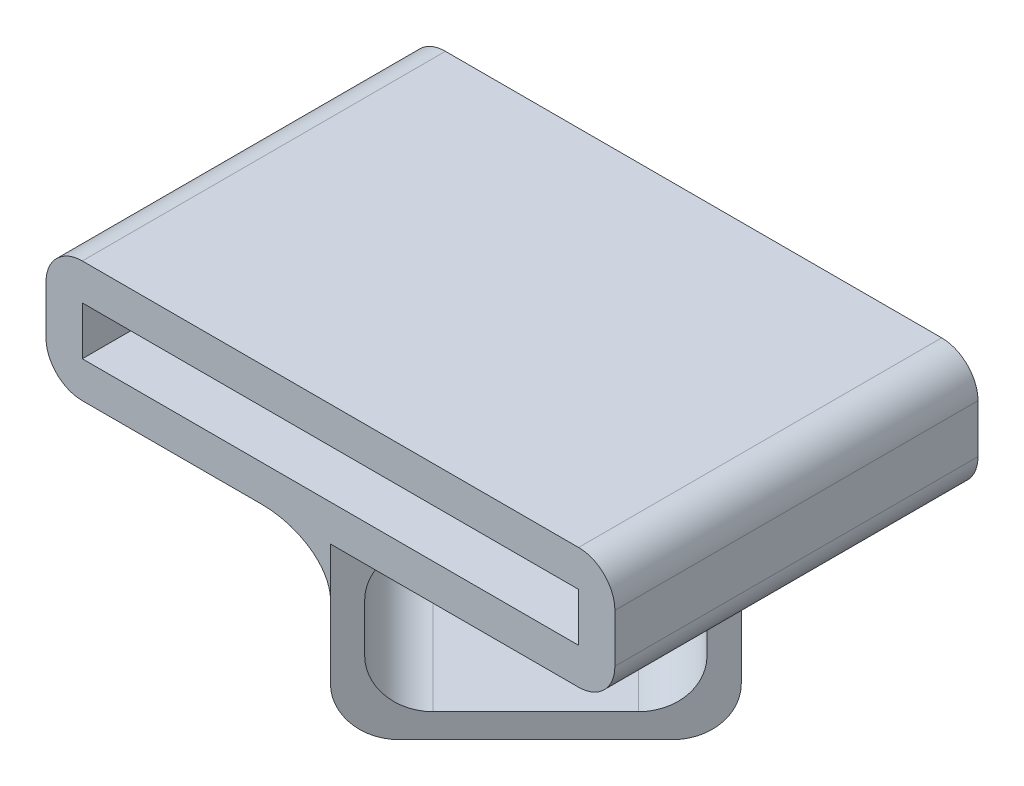
ISO-10303-21;
HEADER;
FILE_DESCRIPTION(('STEP AP214'),'2;1');
FILE_NAME('part.step','',(''),(''),'','','');
FILE_SCHEMA(('AUTOMOTIVE_DESIGN { 1 0 10303 214 1 1 1 1 }'));
ENDSEC;
DATA;
#1=APPLICATION_CONTEXT('core data for automotive mechanical design processes');
#2=APPLICATION_PROTOCOL_DEFINITION('international standard','automotive_design',2000,#1);
#3=PRODUCT_CONTEXT('',#1,'mechanical');
#4=PRODUCT('Part','Part','',(#3));
#5=PRODUCT_RELATED_PRODUCT_CATEGORY('part','',(#4));
#6=PRODUCT_DEFINITION_FORMATION('','',#4);
#7=PRODUCT_DEFINITION_CONTEXT('part definition',#1,'design');
#8=PRODUCT_DEFINITION('design','',#6,#7);
#9=PRODUCT_DEFINITION_SHAPE('','',#8);
#10=(LENGTH_UNIT() NAMED_UNIT(*) SI_UNIT(.MILLI.,.METRE.));
#11=(NAMED_UNIT(*) PLANE_ANGLE_UNIT() SI_UNIT($,.RADIAN.));
#12=(NAMED_UNIT(*) SI_UNIT($,.STERADIAN.) SOLID_ANGLE_UNIT());
#13=UNCERTAINTY_MEASURE_WITH_UNIT(LENGTH_MEASURE(1.E-05),#10,'distance_accuracy_value','');
#14=(GEOMETRIC_REPRESENTATION_CONTEXT(3) GLOBAL_UNCERTAINTY_ASSIGNED_CONTEXT((#13)) GLOBAL_UNIT_ASSIGNED_CONTEXT((#10,
#11,#12)) REPRESENTATION_CONTEXT('',''));
#15=CARTESIAN_POINT('',(0.,0.,0.));
#16=DIRECTION('',(0.,0.,1.));
#17=DIRECTION('',(1.,0.,0.));
#18=AXIS2_PLACEMENT_3D('',#15,#16,#17);
#19=CARTESIAN_POINT('',(1.5,-1.5,15.));
#20=DIRECTION('',(0.,1.,0.));
#21=DIRECTION('',(0.,0.,1.));
#22=AXIS2_PLACEMENT_3D('',#19,#20,#21);
#23=PLANE('',#22);
#24=DIRECTION('',(1.,0.,0.));
#25=VECTOR('',#24,1.);
#26=CARTESIAN_POINT('',(1.5,-1.5,0.));
#27=LINE('',#26,#25);
#28=CARTESIAN_POINT('',(-5.45101012677669,-1.5,0.));
#29=VERTEX_POINT('',#28);
#30=CARTESIAN_POINT('',(0.,-1.5,0.));
#31=VERTEX_POINT('',#30);
#32=EDGE_CURVE('E237',#29,#31,#27,.T.);
#33=ORIENTED_EDGE('',*,*,#32,.T.);
#34=DIRECTION('',(0.,0.,-1.));
#35=VECTOR('',#34,1.);
#36=CARTESIAN_POINT('',(0.,-1.5,15.));
#37=LINE('',#36,#35);
#38=CARTESIAN_POINT('',(0.,-1.5,15.));
#39=VERTEX_POINT('',#38);
#40=EDGE_CURVE('E433',#31,#39,#37,.F.);
#41=ORIENTED_EDGE('',*,*,#40,.T.);
#42=DIRECTION('',(1.,0.,0.));
#43=VECTOR('',#42,1.);
#44=CARTESIAN_POINT('',(1.5,-1.5,15.));
#45=LINE('',#44,#43);
#46=CARTESIAN_POINT('',(-10.25,-1.5,15.));
#47=VERTEX_POINT('',#46);
#48=EDGE_CURVE('E317',#47,#39,#45,.T.);
#49=ORIENTED_EDGE('',*,*,#48,.F.);
#50=DIRECTION('',(-0.707106781186547,0.,0.707106781186548));
#51=VECTOR('',#50,1.);
#52=CARTESIAN_POINT('',(-10.25,-1.5,15.));
#53=LINE('',#52,#51);
#54=CARTESIAN_POINT('',(-8.12867965644037,-1.5,12.8786796564404));
#55=VERTEX_POINT('',#54);
#56=EDGE_CURVE('E262',#55,#47,#53,.T.);
#57=ORIENTED_EDGE('',*,*,#56,.F.);
#58=DIRECTION('',(-0.707106781186548,0.,-0.707106781186547));
#59=VECTOR('',#58,1.);
#60=CARTESIAN_POINT('',(-14.6433982822018,-1.5,6.36396103067894));
#61=LINE('',#60,#59);
#62=CARTESIAN_POINT('',(-14.6433982822018,-1.5,6.36396103067894));
#63=VERTEX_POINT('',#62);
#64=EDGE_CURVE('E358',#55,#63,#61,.T.);
#65=ORIENTED_EDGE('',*,*,#64,.T.);
#66=DIRECTION('',(0.707106781186547,0.,-0.707106781186548));
#67=VECTOR('',#66,1.);
#68=CARTESIAN_POINT('',(-8.27943725152288,-1.5,0.));
#69=LINE('',#68,#67);
#70=CARTESIAN_POINT('',(-18.1789321881345,-1.5,9.89949493661168));
#71=VERTEX_POINT('',#70);
#72=EDGE_CURVE('E259',#71,#63,#69,.T.);
#73=ORIENTED_EDGE('',*,*,#72,.F.);
#74=DIRECTION('',(-0.707106781186549,0.,-0.707106781186546));
#75=VECTOR('',#74,1.);
#76=CARTESIAN_POINT('',(-11.6642135623731,-1.5,16.4142135623731));
#77=LINE('',#76,#75);
#78=CARTESIAN_POINT('',(-13.0784271247462,-1.5,15.));
#79=VERTEX_POINT('',#78);
#80=EDGE_CURVE('E355',#71,#79,#77,.F.);
#81=ORIENTED_EDGE('',*,*,#80,.T.);
#82=CARTESIAN_POINT('',(-20.5,-1.5,15.));
#83=VERTEX_POINT('',#82);
#84=EDGE_CURVE('E314',#83,#79,#45,.T.);
#85=ORIENTED_EDGE('',*,*,#84,.F.);
#86=DIRECTION('',(0.,0.,-1.));
#87=VECTOR('',#86,1.);
#88=CARTESIAN_POINT('',(-20.5,-1.5,15.));
#89=LINE('',#88,#87);
#90=CARTESIAN_POINT('',(-20.5,-1.5,0.));
#91=VERTEX_POINT('',#90);
#92=EDGE_CURVE('E234',#83,#91,#89,.T.);
#93=ORIENTED_EDGE('',*,*,#92,.T.);
#94=CARTESIAN_POINT('',(-8.27943725152288,-1.5,0.));
#95=VERTEX_POINT('',#94);
#96=EDGE_CURVE('E225',#91,#95,#27,.T.);
#97=ORIENTED_EDGE('',*,*,#96,.T.);
#98=CARTESIAN_POINT('',(-10.4007575950825,-1.5,2.12132034355964));
#99=VERTEX_POINT('',#98);
#100=EDGE_CURVE('E230',#99,#95,#69,.T.);
#101=ORIENTED_EDGE('',*,*,#100,.F.);
#102=DIRECTION('',(-0.707106781186548,0.,-0.707106781186547));
#103=VECTOR('',#102,1.);
#104=CARTESIAN_POINT('',(-3.88603896932108,-1.5,8.63603896932107));
#105=LINE('',#104,#103);
#106=CARTESIAN_POINT('',(-3.88603896932108,-1.5,8.63603896932107));
#107=VERTEX_POINT('',#106);
#108=EDGE_CURVE('E361',#99,#107,#105,.F.);
#109=ORIENTED_EDGE('',*,*,#108,.T.);
#110=CARTESIAN_POINT('',(-0.350505063388349,-1.5,5.10050506338832));
#111=VERTEX_POINT('',#110);
#112=EDGE_CURVE('E270',#111,#107,#53,.T.);
#113=ORIENTED_EDGE('',*,*,#112,.F.);
#114=DIRECTION('',(0.707106781186548,0.,0.707106781186547));
#115=VECTOR('',#114,1.);
#116=CARTESIAN_POINT('',(-6.86522368914979,-1.5,-1.4142135623731));
#117=LINE('',#116,#115);
#118=EDGE_CURVE('E363',#111,#29,#117,.F.);
#119=ORIENTED_EDGE('',*,*,#118,.T.);
#120=EDGE_LOOP('',(#33,#41,#49,#57,#65,#73,#81,#85,#93,#97,#101,#109,#113,#119));
#121=FACE_BOUND('',#120,.T.);
#122=ADVANCED_FACE('F33',(#121),#23,.F.);
#123=CARTESIAN_POINT('',(0.,0.,15.));
#124=DIRECTION('',(0.,0.,-1.));
#125=DIRECTION('',(-1.,0.,0.));
#126=AXIS2_PLACEMENT_3D('',#123,#124,#125);
#127=PLANE('',#126);
#128=DIRECTION('',(0.,1.,0.));
#129=VECTOR('',#128,1.);
#130=CARTESIAN_POINT('',(1.5,-1.5,15.));
#131=LINE('',#130,#129);
#132=CARTESIAN_POINT('',(1.5,0.,15.));
#133=VERTEX_POINT('',#132);
#134=CARTESIAN_POINT('',(1.5,2.,15.));
#135=VERTEX_POINT('',#134);
#136=EDGE_CURVE('E316',#133,#135,#131,.T.);
#137=ORIENTED_EDGE('',*,*,#136,.T.);
#138=CARTESIAN_POINT('',(0.,2.,15.));
#139=DIRECTION('',(0.,0.,-1.));
#140=DIRECTION('',(-1.,0.,0.));
#141=AXIS2_PLACEMENT_3D('',#138,#139,#140);
#142=CIRCLE('',#141,1.5);
#143=CARTESIAN_POINT('',(0.,3.5,15.));
#144=VERTEX_POINT('',#143);
#145=EDGE_CURVE('E430',#135,#144,#142,.F.);
#146=ORIENTED_EDGE('',*,*,#145,.T.);
#147=DIRECTION('',(-1.,0.,0.));
#148=VECTOR('',#147,1.);
#149=CARTESIAN_POINT('',(1.5,3.5,15.));
#150=LINE('',#149,#148);
#151=CARTESIAN_POINT('',(-20.5,3.5,15.));
#152=VERTEX_POINT('',#151);
#153=EDGE_CURVE('E320',#144,#152,#150,.T.);
#154=ORIENTED_EDGE('',*,*,#153,.T.);
#155=CARTESIAN_POINT('',(-20.5,2.,15.));
#156=DIRECTION('',(0.,0.,-1.));
#157=DIRECTION('',(-1.,0.,0.));
#158=AXIS2_PLACEMENT_3D('',#155,#156,#157);
#159=CIRCLE('',#158,1.5);
#160=CARTESIAN_POINT('',(-22.,2.,15.));
#161=VERTEX_POINT('',#160);
#162=EDGE_CURVE('E54',#152,#161,#159,.F.);
#163=ORIENTED_EDGE('',*,*,#162,.T.);
#164=DIRECTION('',(0.,-1.,0.));
#165=VECTOR('',#164,1.);
#166=CARTESIAN_POINT('',(-22.,-1.5,15.));
#167=LINE('',#166,#165);
#168=CARTESIAN_POINT('',(-22.,0.,15.));
#169=VERTEX_POINT('',#168);
#170=EDGE_CURVE('E322',#161,#169,#167,.T.);
#171=ORIENTED_EDGE('',*,*,#170,.T.);
#172=CARTESIAN_POINT('',(-20.5,0.,15.));
#173=DIRECTION('',(0.,0.,-1.));
#174=DIRECTION('',(-1.,0.,0.));
#175=AXIS2_PLACEMENT_3D('',#172,#173,#174);
#176=CIRCLE('',#175,1.5);
#177=EDGE_CURVE('E425',#169,#83,#176,.F.);
#178=ORIENTED_EDGE('',*,*,#177,.T.);
#179=ORIENTED_EDGE('',*,*,#84,.T.);
#180=CARTESIAN_POINT('',(-13.0784271247462,-3.5,15.));
#181=DIRECTION('',(0.,0.,-1.));
#182=DIRECTION('',(1.,0.,0.));
#183=AXIS2_PLACEMENT_3D('',#180,#181,#182);
#184=ELLIPSE('',#183,2.8284271247462,2.);
#185=CARTESIAN_POINT('',(-10.25,-3.5,15.));
#186=VERTEX_POINT('',#185);
#187=EDGE_CURVE('E252',#79,#186,#184,.T.);
#188=ORIENTED_EDGE('',*,*,#187,.T.);
#189=DIRECTION('',(0.,-1.,0.));
#190=VECTOR('',#189,1.);
#191=CARTESIAN_POINT('',(-10.25,-8.5,15.));
#192=LINE('',#191,#190);
#193=EDGE_CURVE('E251',#47,#186,#192,.T.);
#194=ORIENTED_EDGE('',*,*,#193,.F.);
#195=ORIENTED_EDGE('',*,*,#48,.T.);
#196=CARTESIAN_POINT('',(0.,0.,15.));
#197=DIRECTION('',(0.,0.,-1.));
#198=DIRECTION('',(-1.,0.,0.));
#199=AXIS2_PLACEMENT_3D('',#196,#197,#198);
#200=CIRCLE('',#199,1.5);
#201=EDGE_CURVE('E428',#39,#133,#200,.F.);
#202=ORIENTED_EDGE('',*,*,#201,.T.);
#203=EDGE_LOOP('',(#137,#146,#154,#163,#171,#178,#179,#188,#194,#195,#202));
#204=FACE_BOUND('',#203,.T.);
#205=DIRECTION('',(0.,1.,0.));
#206=VECTOR('',#205,1.);
#207=CARTESIAN_POINT('',(0.,0.,15.));
#208=LINE('',#207,#206);
#209=CARTESIAN_POINT('',(0.,0.,15.));
#210=VERTEX_POINT('',#209);
#211=CARTESIAN_POINT('',(0.,2.,15.));
#212=VERTEX_POINT('',#211);
#213=EDGE_CURVE('E284',#210,#212,#208,.T.);
#214=ORIENTED_EDGE('',*,*,#213,.F.);
#215=DIRECTION('',(1.,0.,0.));
#216=VECTOR('',#215,1.);
#217=CARTESIAN_POINT('',(0.,0.,15.));
#218=LINE('',#217,#216);
#219=CARTESIAN_POINT('',(-20.5,0.,15.));
#220=VERTEX_POINT('',#219);
#221=EDGE_CURVE('E292',#220,#210,#218,.T.);
#222=ORIENTED_EDGE('',*,*,#221,.F.);
#223=DIRECTION('',(0.,-1.,0.));
#224=VECTOR('',#223,1.);
#225=CARTESIAN_POINT('',(-20.5,0.,15.));
#226=LINE('',#225,#224);
#227=CARTESIAN_POINT('',(-20.5,2.,15.));
#228=VERTEX_POINT('',#227);
#229=EDGE_CURVE('E289',#228,#220,#226,.T.);
#230=ORIENTED_EDGE('',*,*,#229,.F.);
#231=DIRECTION('',(-1.,0.,0.));
#232=VECTOR('',#231,1.);
#233=CARTESIAN_POINT('',(0.,2.,15.));
#234=LINE('',#233,#232);
#235=EDGE_CURVE('E286',#212,#228,#234,.T.);
#236=ORIENTED_EDGE('',*,*,#235,.F.);
#237=EDGE_LOOP('',(#214,#222,#230,#236));
#238=FACE_BOUND('',#237,.T.);
#239=ADVANCED_FACE('F439',(#204,#238),#127,.F.);
#240=CARTESIAN_POINT('',(0.,0.,0.));
#241=DIRECTION('',(0.,0.,-1.));
#242=DIRECTION('',(-1.,0.,0.));
#243=AXIS2_PLACEMENT_3D('',#240,#241,#242);
#244=PLANE('',#243);
#245=DIRECTION('',(-1.,0.,0.));
#246=VECTOR('',#245,1.);
#247=CARTESIAN_POINT('',(1.5,3.5,0.));
#248=LINE('',#247,#246);
#249=CARTESIAN_POINT('',(0.,3.5,0.));
#250=VERTEX_POINT('',#249);
#251=CARTESIAN_POINT('',(-20.5,3.5,0.));
#252=VERTEX_POINT('',#251);
#253=EDGE_CURVE('E327',#250,#252,#248,.T.);
#254=ORIENTED_EDGE('',*,*,#253,.F.);
#255=CARTESIAN_POINT('',(0.,2.,0.));
#256=DIRECTION('',(0.,0.,-1.));
#257=DIRECTION('',(-1.,0.,0.));
#258=AXIS2_PLACEMENT_3D('',#255,#256,#257);
#259=CIRCLE('',#258,1.5);
#260=CARTESIAN_POINT('',(1.5,2.,0.));
#261=VERTEX_POINT('',#260);
#262=EDGE_CURVE('E418',#250,#261,#259,.T.);
#263=ORIENTED_EDGE('',*,*,#262,.T.);
#264=DIRECTION('',(0.,1.,0.));
#265=VECTOR('',#264,1.);
#266=CARTESIAN_POINT('',(1.5,-1.5,0.));
#267=LINE('',#266,#265);
#268=CARTESIAN_POINT('',(1.5,0.,0.));
#269=VERTEX_POINT('',#268);
#270=EDGE_CURVE('E236',#269,#261,#267,.T.);
#271=ORIENTED_EDGE('',*,*,#270,.F.);
#272=CARTESIAN_POINT('',(0.,0.,0.));
#273=DIRECTION('',(0.,0.,-1.));
#274=DIRECTION('',(-1.,0.,0.));
#275=AXIS2_PLACEMENT_3D('',#272,#273,#274);
#276=CIRCLE('',#275,1.5);
#277=EDGE_CURVE('E416',#269,#31,#276,.T.);
#278=ORIENTED_EDGE('',*,*,#277,.T.);
#279=ORIENTED_EDGE('',*,*,#32,.F.);
#280=CARTESIAN_POINT('',(-5.45101012677668,-3.5,0.));
#281=DIRECTION('',(0.,0.,-1.));
#282=DIRECTION('',(-1.,0.,0.));
#283=AXIS2_PLACEMENT_3D('',#280,#281,#282);
#284=ELLIPSE('',#283,2.82842712474619,2.);
#285=CARTESIAN_POINT('',(-8.27943725152288,-3.5,0.));
#286=VERTEX_POINT('',#285);
#287=EDGE_CURVE('E247',#29,#286,#284,.F.);
#288=ORIENTED_EDGE('',*,*,#287,.T.);
#289=DIRECTION('',(0.,-1.,0.));
#290=VECTOR('',#289,1.);
#291=CARTESIAN_POINT('',(-8.27943725152288,0.,0.));
#292=LINE('',#291,#290);
#293=EDGE_CURVE('E241',#95,#286,#292,.T.);
#294=ORIENTED_EDGE('',*,*,#293,.F.);
#295=ORIENTED_EDGE('',*,*,#96,.F.);
#296=CARTESIAN_POINT('',(-20.5,0.,0.));
#297=DIRECTION('',(0.,0.,-1.));
#298=DIRECTION('',(-1.,0.,0.));
#299=AXIS2_PLACEMENT_3D('',#296,#297,#298);
#300=CIRCLE('',#299,1.5);
#301=CARTESIAN_POINT('',(-22.,0.,0.));
#302=VERTEX_POINT('',#301);
#303=EDGE_CURVE('E412',#91,#302,#300,.T.);
#304=ORIENTED_EDGE('',*,*,#303,.T.);
#305=DIRECTION('',(0.,-1.,0.));
#306=VECTOR('',#305,1.);
#307=CARTESIAN_POINT('',(-22.,-1.5,0.));
#308=LINE('',#307,#306);
#309=CARTESIAN_POINT('',(-22.,2.,0.));
#310=VERTEX_POINT('',#309);
#311=EDGE_CURVE('E330',#310,#302,#308,.T.);
#312=ORIENTED_EDGE('',*,*,#311,.F.);
#313=CARTESIAN_POINT('',(-20.5,2.,0.));
#314=DIRECTION('',(0.,0.,-1.));
#315=DIRECTION('',(-1.,0.,0.));
#316=AXIS2_PLACEMENT_3D('',#313,#314,#315);
#317=CIRCLE('',#316,1.5);
#318=EDGE_CURVE('E414',#310,#252,#317,.T.);
#319=ORIENTED_EDGE('',*,*,#318,.T.);
#320=EDGE_LOOP('',(#254,#263,#271,#278,#279,#288,#294,#295,#304,#312,#319));
#321=FACE_BOUND('',#320,.T.);
#322=DIRECTION('',(1.,0.,0.));
#323=VECTOR('',#322,1.);
#324=CARTESIAN_POINT('',(0.,0.,0.));
#325=LINE('',#324,#323);
#326=CARTESIAN_POINT('',(-20.5,0.,0.));
#327=VERTEX_POINT('',#326);
#328=CARTESIAN_POINT('',(0.,0.,0.));
#329=VERTEX_POINT('',#328);
#330=EDGE_CURVE('E287',#327,#329,#325,.T.);
#331=ORIENTED_EDGE('',*,*,#330,.T.);
#332=DIRECTION('',(0.,1.,0.));
#333=VECTOR('',#332,1.);
#334=CARTESIAN_POINT('',(0.,0.,0.));
#335=LINE('',#334,#333);
#336=CARTESIAN_POINT('',(0.,2.,0.));
#337=VERTEX_POINT('',#336);
#338=EDGE_CURVE('E283',#329,#337,#335,.T.);
#339=ORIENTED_EDGE('',*,*,#338,.T.);
#340=DIRECTION('',(-1.,0.,0.));
#341=VECTOR('',#340,1.);
#342=CARTESIAN_POINT('',(0.,2.,0.));
#343=LINE('',#342,#341);
#344=CARTESIAN_POINT('',(-20.5,2.,0.));
#345=VERTEX_POINT('',#344);
#346=EDGE_CURVE('E297',#337,#345,#343,.T.);
#347=ORIENTED_EDGE('',*,*,#346,.T.);
#348=DIRECTION('',(0.,-1.,0.));
#349=VECTOR('',#348,1.);
#350=CARTESIAN_POINT('',(-20.5,0.,0.));
#351=LINE('',#350,#349);
#352=EDGE_CURVE('E300',#345,#327,#351,.T.);
#353=ORIENTED_EDGE('',*,*,#352,.T.);
#354=EDGE_LOOP('',(#331,#339,#347,#353));
#355=FACE_BOUND('',#354,.T.);
#356=ADVANCED_FACE('F243',(#321,#355),#244,.T.);
#357=CARTESIAN_POINT('',(1.5,-1.5,15.));
#358=DIRECTION('',(-1.,0.,0.));
#359=DIRECTION('',(0.,0.,1.));
#360=AXIS2_PLACEMENT_3D('',#357,#358,#359);
#361=PLANE('',#360);
#362=ORIENTED_EDGE('',*,*,#270,.T.);
#363=DIRECTION('',(0.,0.,-1.));
#364=VECTOR('',#363,1.);
#365=CARTESIAN_POINT('',(1.5,2.,15.));
#366=LINE('',#365,#364);
#367=EDGE_CURVE('E423',#261,#135,#366,.F.);
#368=ORIENTED_EDGE('',*,*,#367,.T.);
#369=ORIENTED_EDGE('',*,*,#136,.F.);
#370=DIRECTION('',(0.,0.,-1.));
#371=VECTOR('',#370,1.);
#372=CARTESIAN_POINT('',(1.5,0.,15.));
#373=LINE('',#372,#371);
#374=EDGE_CURVE('E420',#133,#269,#373,.T.);
#375=ORIENTED_EDGE('',*,*,#374,.T.);
#376=EDGE_LOOP('',(#362,#368,#369,#375));
#377=FACE_BOUND('',#376,.T.);
#378=ADVANCED_FACE('F447',(#377),#361,.F.);
#379=CARTESIAN_POINT('',(1.5,3.5,15.));
#380=DIRECTION('',(0.,-1.,0.));
#381=DIRECTION('',(1.,0.,0.));
#382=AXIS2_PLACEMENT_3D('',#379,#380,#381);
#383=PLANE('',#382);
#384=ORIENTED_EDGE('',*,*,#153,.F.);
#385=DIRECTION('',(0.,0.,-1.));
#386=VECTOR('',#385,1.);
#387=CARTESIAN_POINT('',(0.,3.5,15.));
#388=LINE('',#387,#386);
#389=EDGE_CURVE('E409',#144,#250,#388,.T.);
#390=ORIENTED_EDGE('',*,*,#389,.T.);
#391=ORIENTED_EDGE('',*,*,#253,.T.);
#392=DIRECTION('',(0.,0.,-1.));
#393=VECTOR('',#392,1.);
#394=CARTESIAN_POINT('',(-20.5,3.5,15.));
#395=LINE('',#394,#393);
#396=EDGE_CURVE('E407',#252,#152,#395,.F.);
#397=ORIENTED_EDGE('',*,*,#396,.T.);
#398=EDGE_LOOP('',(#384,#390,#391,#397));
#399=FACE_BOUND('',#398,.T.);
#400=ADVANCED_FACE('F455',(#399),#383,.F.);
#401=CARTESIAN_POINT('',(-22.,-1.5,15.));
#402=DIRECTION('',(1.,0.,0.));
#403=DIRECTION('',(0.,0.,-1.));
#404=AXIS2_PLACEMENT_3D('',#401,#402,#403);
#405=PLANE('',#404);
#406=ORIENTED_EDGE('',*,*,#170,.F.);
#407=DIRECTION('',(0.,0.,-1.));
#408=VECTOR('',#407,1.);
#409=CARTESIAN_POINT('',(-22.,2.,15.));
#410=LINE('',#409,#408);
#411=EDGE_CURVE('E11',#161,#310,#410,.T.);
#412=ORIENTED_EDGE('',*,*,#411,.T.);
#413=ORIENTED_EDGE('',*,*,#311,.T.);
#414=DIRECTION('',(0.,0.,-1.));
#415=VECTOR('',#414,1.);
#416=CARTESIAN_POINT('',(-22.,0.,15.));
#417=LINE('',#416,#415);
#418=EDGE_CURVE('E41',#302,#169,#417,.F.);
#419=ORIENTED_EDGE('',*,*,#418,.T.);
#420=EDGE_LOOP('',(#406,#412,#413,#419));
#421=FACE_BOUND('',#420,.T.);
#422=ADVANCED_FACE('F461',(#421),#405,.F.);
#423=CARTESIAN_POINT('',(0.,0.,15.));
#424=DIRECTION('',(-1.,0.,0.));
#425=DIRECTION('',(0.,-1.,0.));
#426=AXIS2_PLACEMENT_3D('',#423,#424,#425);
#427=PLANE('',#426);
#428=ORIENTED_EDGE('',*,*,#338,.F.);
#429=DIRECTION('',(0.,0.,-1.));
#430=VECTOR('',#429,1.);
#431=CARTESIAN_POINT('',(0.,0.,15.));
#432=LINE('',#431,#430);
#433=EDGE_CURVE('E294',#210,#329,#432,.T.);
#434=ORIENTED_EDGE('',*,*,#433,.F.);
#435=ORIENTED_EDGE('',*,*,#213,.T.);
#436=DIRECTION('',(0.,0.,-1.));
#437=VECTOR('',#436,1.);
#438=CARTESIAN_POINT('',(0.,2.,15.));
#439=LINE('',#438,#437);
#440=EDGE_CURVE('E311',#212,#337,#439,.T.);
#441=ORIENTED_EDGE('',*,*,#440,.T.);
#442=EDGE_LOOP('',(#428,#434,#435,#441));
#443=FACE_BOUND('',#442,.T.);
#444=ADVANCED_FACE('F592',(#443),#427,.T.);
#445=CARTESIAN_POINT('',(0.,2.,15.));
#446=DIRECTION('',(0.,-1.,0.));
#447=DIRECTION('',(1.,0.,0.));
#448=AXIS2_PLACEMENT_3D('',#445,#446,#447);
#449=PLANE('',#448);
#450=ORIENTED_EDGE('',*,*,#346,.F.);
#451=ORIENTED_EDGE('',*,*,#440,.F.);
#452=ORIENTED_EDGE('',*,*,#235,.T.);
#453=DIRECTION('',(0.,0.,-1.));
#454=VECTOR('',#453,1.);
#455=CARTESIAN_POINT('',(-20.5,2.,15.));
#456=LINE('',#455,#454);
#457=EDGE_CURVE('E309',#228,#345,#456,.T.);
#458=ORIENTED_EDGE('',*,*,#457,.T.);
#459=EDGE_LOOP('',(#450,#451,#452,#458));
#460=FACE_BOUND('',#459,.T.);
#461=ADVANCED_FACE('F751',(#460),#449,.T.);
#462=CARTESIAN_POINT('',(-20.5,0.,15.));
#463=DIRECTION('',(1.,0.,0.));
#464=DIRECTION('',(0.,0.,-1.));
#465=AXIS2_PLACEMENT_3D('',#462,#463,#464);
#466=PLANE('',#465);
#467=ORIENTED_EDGE('',*,*,#352,.F.);
#468=ORIENTED_EDGE('',*,*,#457,.F.);
#469=ORIENTED_EDGE('',*,*,#229,.T.);
#470=DIRECTION('',(0.,0.,-1.));
#471=VECTOR('',#470,1.);
#472=CARTESIAN_POINT('',(-20.5,0.,15.));
#473=LINE('',#472,#471);
#474=EDGE_CURVE('E307',#220,#327,#473,.T.);
#475=ORIENTED_EDGE('',*,*,#474,.T.);
#476=EDGE_LOOP('',(#467,#468,#469,#475));
#477=FACE_BOUND('',#476,.T.);
#478=ADVANCED_FACE('F518',(#477),#466,.T.);
#479=CARTESIAN_POINT('',(0.,0.,15.));
#480=DIRECTION('',(0.,1.,0.));
#481=DIRECTION('',(-1.,0.,0.));
#482=AXIS2_PLACEMENT_3D('',#479,#480,#481);
#483=PLANE('',#482);
#484=ORIENTED_EDGE('',*,*,#330,.F.);
#485=ORIENTED_EDGE('',*,*,#474,.F.);
#486=ORIENTED_EDGE('',*,*,#221,.T.);
#487=ORIENTED_EDGE('',*,*,#433,.T.);
#488=EDGE_LOOP('',(#484,#485,#486,#487));
#489=FACE_BOUND('',#488,.T.);
#490=ADVANCED_FACE('F510',(#489),#483,.T.);
#491=CARTESIAN_POINT('',(-16.7647186257614,-8.5,8.48528137423858));
#492=DIRECTION('',(0.707106781186546,0.,-0.707106781186549));
#493=DIRECTION('',(-0.707106781186549,0.,-0.707106781186546));
#494=AXIS2_PLACEMENT_3D('',#491,#492,#493);
#495=PLANE('',#494);
#496=DIRECTION('',(0.,1.,0.));
#497=VECTOR('',#496,1.);
#498=CARTESIAN_POINT('',(-16.7647186257614,-8.5,8.48528137423858));
#499=LINE('',#498,#497);
#500=CARTESIAN_POINT('',(-16.7647186257614,-6.5,8.48528137423858));
#501=VERTEX_POINT('',#500);
#502=CARTESIAN_POINT('',(-16.7647186257614,-3.5,8.48528137423858));
#503=VERTEX_POINT('',#502);
#504=EDGE_CURVE('E280',#501,#503,#499,.T.);
#505=ORIENTED_EDGE('',*,*,#504,.F.);
#506=DIRECTION('',(-0.707106781186549,0.,-0.707106781186546));
#507=VECTOR('',#506,1.);
#508=CARTESIAN_POINT('',(-16.7647186257614,-6.5,8.48528137423858));
#509=LINE('',#508,#507);
#510=CARTESIAN_POINT('',(-10.25,-6.5,15.));
#511=VERTEX_POINT('',#510);
#512=EDGE_CURVE('E344',#501,#511,#509,.F.);
#513=ORIENTED_EDGE('',*,*,#512,.T.);
#514=DIRECTION('',(0.,1.,0.));
#515=VECTOR('',#514,1.);
#516=CARTESIAN_POINT('',(-10.25,-8.5,15.));
#517=LINE('',#516,#515);
#518=EDGE_CURVE('E273',#511,#186,#517,.T.);
#519=ORIENTED_EDGE('',*,*,#518,.T.);
#520=DIRECTION('',(-0.707106781186549,0.,-0.707106781186546));
#521=VECTOR('',#520,1.);
#522=CARTESIAN_POINT('',(-16.7647186257614,-3.5,8.48528137423858));
#523=LINE('',#522,#521);
#524=EDGE_CURVE('E341',#186,#503,#523,.T.);
#525=ORIENTED_EDGE('',*,*,#524,.T.);
#526=EDGE_LOOP('',(#505,#513,#519,#525));
#527=FACE_BOUND('',#526,.T.);
#528=ADVANCED_FACE('F508',(#527),#495,.F.);
#529=CARTESIAN_POINT('',(-8.27943725152288,-8.5,0.));
#530=DIRECTION('',(0.707106781186548,0.,0.707106781186547));
#531=DIRECTION('',(0.707106781186547,0.,-0.707106781186548));
#532=AXIS2_PLACEMENT_3D('',#529,#530,#531);
#533=PLANE('',#532);
#534=DIRECTION('',(0.707106781186547,0.,-0.707106781186548));
#535=VECTOR('',#534,1.);
#536=CARTESIAN_POINT('',(-8.27943725152288,-8.5,0.));
#537=LINE('',#536,#535);
#538=CARTESIAN_POINT('',(-15.3505050633883,-8.5,7.07106781186549));
#539=VERTEX_POINT('',#538);
#540=CARTESIAN_POINT('',(-9.69365081389597,-8.5,1.4142135623731));
#541=VERTEX_POINT('',#540);
#542=EDGE_CURVE('E272',#539,#541,#537,.T.);
#543=ORIENTED_EDGE('',*,*,#542,.F.);
#544=CARTESIAN_POINT('',(-15.3505050633883,-6.5,7.07106781186549));
#545=DIRECTION('',(0.707106781186548,0.,0.707106781186547));
#546=DIRECTION('',(0.707106781186547,0.,-0.707106781186548));
#547=AXIS2_PLACEMENT_3D('',#544,#545,#546);
#548=CIRCLE('',#547,2.);
#549=EDGE_CURVE('E339',#539,#501,#548,.F.);
#550=ORIENTED_EDGE('',*,*,#549,.T.);
#551=ORIENTED_EDGE('',*,*,#504,.T.);
#552=CARTESIAN_POINT('',(-18.1789321881345,-3.5,9.89949493661168));
#553=DIRECTION('',(0.707106781186548,0.,0.707106781186547));
#554=DIRECTION('',(0.707106781186547,0.,-0.707106781186548));
#555=AXIS2_PLACEMENT_3D('',#552,#553,#554);
#556=CIRCLE('',#555,2.);
#557=EDGE_CURVE('E400',#503,#71,#556,.T.);
#558=ORIENTED_EDGE('',*,*,#557,.T.);
#559=ORIENTED_EDGE('',*,*,#72,.T.);
#560=CARTESIAN_POINT('',(-14.6433982822018,-3.5,6.36396103067893));
#561=DIRECTION('',(0.707106781186548,0.,0.707106781186547));
#562=DIRECTION('',(0.707106781186547,0.,-0.707106781186548));
#563=AXIS2_PLACEMENT_3D('',#560,#561,#562);
#564=CIRCLE('',#563,2.);
#565=CARTESIAN_POINT('',(-16.0576118445749,-3.5,7.77817459305203));
#566=VERTEX_POINT('',#565);
#567=EDGE_CURVE('E395',#63,#566,#564,.T.);
#568=ORIENTED_EDGE('',*,*,#567,.T.);
#569=DIRECTION('',(0.,1.,0.));
#570=VECTOR('',#569,1.);
#571=CARTESIAN_POINT('',(-16.0576118445749,-7.5,7.77817459305203));
#572=LINE('',#571,#570);
#573=CARTESIAN_POINT('',(-16.0576118445749,-5.5,7.77817459305203));
#574=VERTEX_POINT('',#573);
#575=EDGE_CURVE('E482',#574,#566,#572,.T.);
#576=ORIENTED_EDGE('',*,*,#575,.F.);
#577=CARTESIAN_POINT('',(-14.6433982822018,-5.5,6.36396103067894));
#578=DIRECTION('',(0.707106781186548,0.,0.707106781186547));
#579=DIRECTION('',(0.707106781186547,0.,-0.707106781186548));
#580=AXIS2_PLACEMENT_3D('',#577,#578,#579);
#581=CIRCLE('',#580,2.);
#582=CARTESIAN_POINT('',(-14.6433982822018,-7.5,6.36396103067894));
#583=VERTEX_POINT('',#582);
#584=EDGE_CURVE('E388',#574,#583,#581,.T.);
#585=ORIENTED_EDGE('',*,*,#584,.T.);
#586=DIRECTION('',(-0.707106781186547,0.,0.707106781186548));
#587=VECTOR('',#586,1.);
#588=CARTESIAN_POINT('',(-16.0576118445749,-7.5,7.77817459305203));
#589=LINE('',#588,#587);
#590=CARTESIAN_POINT('',(-10.4007575950825,-7.5,2.12132034355964));
#591=VERTEX_POINT('',#590);
#592=EDGE_CURVE('E490',#591,#583,#589,.T.);
#593=ORIENTED_EDGE('',*,*,#592,.F.);
#594=CARTESIAN_POINT('',(-10.4007575950825,-5.5,2.12132034355964));
#595=DIRECTION('',(0.707106781186548,0.,0.707106781186547));
#596=DIRECTION('',(0.707106781186547,0.,-0.707106781186548));
#597=AXIS2_PLACEMENT_3D('',#594,#595,#596);
#598=CIRCLE('',#597,2.);
#599=CARTESIAN_POINT('',(-8.98654403270942,-5.5,0.707106781186547));
#600=VERTEX_POINT('',#599);
#601=EDGE_CURVE('E384',#591,#600,#598,.T.);
#602=ORIENTED_EDGE('',*,*,#601,.T.);
#603=DIRECTION('',(0.,-1.,0.));
#604=VECTOR('',#603,1.);
#605=CARTESIAN_POINT('',(-8.98654403270942,-7.5,0.707106781186547));
#606=LINE('',#605,#604);
#607=CARTESIAN_POINT('',(-8.98654403270942,-3.5,0.707106781186547));
#608=VERTEX_POINT('',#607);
#609=EDGE_CURVE('E487',#608,#600,#606,.T.);
#610=ORIENTED_EDGE('',*,*,#609,.F.);
#611=CARTESIAN_POINT('',(-10.4007575950825,-3.5,2.12132034355964));
#612=DIRECTION('',(0.707106781186548,0.,0.707106781186547));
#613=DIRECTION('',(0.707106781186547,0.,-0.707106781186548));
#614=AXIS2_PLACEMENT_3D('',#611,#612,#613);
#615=CIRCLE('',#614,2.);
#616=EDGE_CURVE('E257',#608,#99,#615,.T.);
#617=ORIENTED_EDGE('',*,*,#616,.T.);
#618=ORIENTED_EDGE('',*,*,#100,.T.);
#619=ORIENTED_EDGE('',*,*,#293,.T.);
#620=DIRECTION('',(0.,1.,0.));
#621=VECTOR('',#620,1.);
#622=CARTESIAN_POINT('',(-8.27943725152288,-8.5,0.));
#623=LINE('',#622,#621);
#624=CARTESIAN_POINT('',(-8.27943725152288,-6.5,0.));
#625=VERTEX_POINT('',#624);
#626=EDGE_CURVE('E278',#625,#286,#623,.T.);
#627=ORIENTED_EDGE('',*,*,#626,.F.);
#628=CARTESIAN_POINT('',(-9.69365081389597,-6.5,1.4142135623731));
#629=DIRECTION('',(0.707106781186548,0.,0.707106781186547));
#630=DIRECTION('',(0.707106781186547,0.,-0.707106781186548));
#631=AXIS2_PLACEMENT_3D('',#628,#629,#630);
#632=CIRCLE('',#631,2.);
#633=EDGE_CURVE('E337',#625,#541,#632,.F.);
#634=ORIENTED_EDGE('',*,*,#633,.T.);
#635=EDGE_LOOP('',(#543,#550,#551,#558,#559,#568,#576,#585,#593,#602,#610,#617,#618,#619,#627,#634));
#636=FACE_BOUND('',#635,.T.);
#637=ADVANCED_FACE('F255',(#636),#533,.F.);
#638=CARTESIAN_POINT('',(-1.76471862576144,-8.5,6.51471862576142));
#639=DIRECTION('',(-0.707106781186547,0.,0.707106781186548));
#640=DIRECTION('',(0.707106781186548,0.,0.707106781186547));
#641=AXIS2_PLACEMENT_3D('',#638,#639,#640);
#642=PLANE('',#641);
#643=DIRECTION('',(0.,1.,0.));
#644=VECTOR('',#643,1.);
#645=CARTESIAN_POINT('',(-1.76471862576144,-8.5,6.51471862576142));
#646=LINE('',#645,#644);
#647=CARTESIAN_POINT('',(-1.76471862576144,-6.5,6.51471862576142));
#648=VERTEX_POINT('',#647);
#649=CARTESIAN_POINT('',(-1.76471862576144,-3.5,6.51471862576142));
#650=VERTEX_POINT('',#649);
#651=EDGE_CURVE('E275',#648,#650,#646,.T.);
#652=ORIENTED_EDGE('',*,*,#651,.F.);
#653=DIRECTION('',(0.707106781186548,0.,0.707106781186547));
#654=VECTOR('',#653,1.);
#655=CARTESIAN_POINT('',(-1.76471862576144,-6.5,6.51471862576142));
#656=LINE('',#655,#654);
#657=EDGE_CURVE('E353',#648,#625,#656,.F.);
#658=ORIENTED_EDGE('',*,*,#657,.T.);
#659=ORIENTED_EDGE('',*,*,#626,.T.);
#660=DIRECTION('',(0.707106781186548,0.,0.707106781186547));
#661=VECTOR('',#660,1.);
#662=CARTESIAN_POINT('',(-1.76471862576144,-3.5,6.51471862576142));
#663=LINE('',#662,#661);
#664=EDGE_CURVE('E350',#286,#650,#663,.T.);
#665=ORIENTED_EDGE('',*,*,#664,.T.);
#666=EDGE_LOOP('',(#652,#658,#659,#665));
#667=FACE_BOUND('',#666,.T.);
#668=ADVANCED_FACE('F516',(#667),#642,.F.);
#669=CARTESIAN_POINT('',(-10.25,-8.5,15.));
#670=DIRECTION('',(-0.707106781186548,0.,-0.707106781186547));
#671=DIRECTION('',(-0.707106781186547,0.,0.707106781186548));
#672=AXIS2_PLACEMENT_3D('',#669,#670,#671);
#673=PLANE('',#672);
#674=ORIENTED_EDGE('',*,*,#518,.F.);
#675=CARTESIAN_POINT('',(-8.83578643762691,-6.5,13.5857864376269));
#676=DIRECTION('',(-0.707106781186548,0.,-0.707106781186547));
#677=DIRECTION('',(-0.707106781186547,0.,0.707106781186548));
#678=AXIS2_PLACEMENT_3D('',#675,#676,#677);
#679=CIRCLE('',#678,2.);
#680=CARTESIAN_POINT('',(-8.83578643762691,-8.5,13.5857864376269));
#681=VERTEX_POINT('',#680);
#682=EDGE_CURVE('E348',#511,#681,#679,.F.);
#683=ORIENTED_EDGE('',*,*,#682,.T.);
#684=DIRECTION('',(-0.707106781186547,0.,0.707106781186548));
#685=VECTOR('',#684,1.);
#686=CARTESIAN_POINT('',(-10.25,-8.5,15.));
#687=LINE('',#686,#685);
#688=CARTESIAN_POINT('',(-3.17893218813453,-8.5,7.92893218813452));
#689=VERTEX_POINT('',#688);
#690=EDGE_CURVE('E268',#689,#681,#687,.T.);
#691=ORIENTED_EDGE('',*,*,#690,.F.);
#692=CARTESIAN_POINT('',(-3.17893218813454,-6.5,7.92893218813452));
#693=DIRECTION('',(-0.707106781186548,0.,-0.707106781186547));
#694=DIRECTION('',(-0.707106781186547,0.,0.707106781186548));
#695=AXIS2_PLACEMENT_3D('',#692,#693,#694);
#696=CIRCLE('',#695,2.);
#697=EDGE_CURVE('E346',#689,#648,#696,.F.);
#698=ORIENTED_EDGE('',*,*,#697,.T.);
#699=ORIENTED_EDGE('',*,*,#651,.T.);
#700=CARTESIAN_POINT('',(-0.350505063388349,-3.5,5.10050506338832));
#701=DIRECTION('',(-0.707106781186548,0.,-0.707106781186547));
#702=DIRECTION('',(-0.707106781186547,0.,0.707106781186548));
#703=AXIS2_PLACEMENT_3D('',#700,#701,#702);
#704=CIRCLE('',#703,2.);
#705=EDGE_CURVE('E380',#650,#111,#704,.T.);
#706=ORIENTED_EDGE('',*,*,#705,.T.);
#707=ORIENTED_EDGE('',*,*,#112,.T.);
#708=CARTESIAN_POINT('',(-3.88603896932108,-3.5,8.63603896932107));
#709=DIRECTION('',(-0.707106781186548,0.,-0.707106781186547));
#710=DIRECTION('',(-0.707106781186547,0.,0.707106781186548));
#711=AXIS2_PLACEMENT_3D('',#708,#709,#710);
#712=CIRCLE('',#711,2.);
#713=CARTESIAN_POINT('',(-2.47182540694799,-3.5,7.22182540694797));
#714=VERTEX_POINT('',#713);
#715=EDGE_CURVE('E393',#107,#714,#712,.T.);
#716=ORIENTED_EDGE('',*,*,#715,.T.);
#717=DIRECTION('',(0.,-1.,0.));
#718=VECTOR('',#717,1.);
#719=CARTESIAN_POINT('',(-2.47182540694799,-7.5,7.22182540694797));
#720=LINE('',#719,#718);
#721=CARTESIAN_POINT('',(-2.47182540694799,-5.5,7.22182540694797));
#722=VERTEX_POINT('',#721);
#723=EDGE_CURVE('E264',#714,#722,#720,.T.);
#724=ORIENTED_EDGE('',*,*,#723,.T.);
#725=CARTESIAN_POINT('',(-3.88603896932108,-5.5,8.63603896932107));
#726=DIRECTION('',(-0.707106781186548,0.,-0.707106781186547));
#727=DIRECTION('',(-0.707106781186547,0.,0.707106781186548));
#728=AXIS2_PLACEMENT_3D('',#725,#726,#727);
#729=CIRCLE('',#728,2.);
#730=CARTESIAN_POINT('',(-3.88603896932108,-7.5,8.63603896932107));
#731=VERTEX_POINT('',#730);
#732=EDGE_CURVE('E386',#722,#731,#729,.T.);
#733=ORIENTED_EDGE('',*,*,#732,.T.);
#734=DIRECTION('',(-0.707106781186547,0.,0.707106781186548));
#735=VECTOR('',#734,1.);
#736=CARTESIAN_POINT('',(-9.54289321881346,-7.5,14.2928932188135));
#737=LINE('',#736,#735);
#738=CARTESIAN_POINT('',(-8.12867965644037,-7.5,12.8786796564404));
#739=VERTEX_POINT('',#738);
#740=EDGE_CURVE('E260',#731,#739,#737,.T.);
#741=ORIENTED_EDGE('',*,*,#740,.T.);
#742=CARTESIAN_POINT('',(-8.12867965644037,-5.5,12.8786796564404));
#743=DIRECTION('',(-0.707106781186548,0.,-0.707106781186547));
#744=DIRECTION('',(-0.707106781186547,0.,0.707106781186548));
#745=AXIS2_PLACEMENT_3D('',#742,#743,#744);
#746=CIRCLE('',#745,2.);
#747=CARTESIAN_POINT('',(-9.54289321881346,-5.5,14.2928932188135));
#748=VERTEX_POINT('',#747);
#749=EDGE_CURVE('E390',#739,#748,#746,.T.);
#750=ORIENTED_EDGE('',*,*,#749,.T.);
#751=DIRECTION('',(0.,1.,0.));
#752=VECTOR('',#751,1.);
#753=CARTESIAN_POINT('',(-9.54289321881346,-7.5,14.2928932188135));
#754=LINE('',#753,#752);
#755=CARTESIAN_POINT('',(-9.54289321881346,-3.5,14.2928932188135));
#756=VERTEX_POINT('',#755);
#757=EDGE_CURVE('E495',#748,#756,#754,.T.);
#758=ORIENTED_EDGE('',*,*,#757,.T.);
#759=CARTESIAN_POINT('',(-8.12867965644036,-3.5,12.8786796564404));
#760=DIRECTION('',(-0.707106781186548,0.,-0.707106781186547));
#761=DIRECTION('',(-0.707106781186547,0.,0.707106781186548));
#762=AXIS2_PLACEMENT_3D('',#759,#760,#761);
#763=CIRCLE('',#762,2.);
#764=EDGE_CURVE('E397',#756,#55,#763,.T.);
#765=ORIENTED_EDGE('',*,*,#764,.T.);
#766=ORIENTED_EDGE('',*,*,#56,.T.);
#767=ORIENTED_EDGE('',*,*,#193,.T.);
#768=EDGE_LOOP('',(#674,#683,#691,#698,#699,#706,#707,#716,#724,#733,#741,#750,#758,#765,#766,#767));
#769=FACE_BOUND('',#768,.T.);
#770=ADVANCED_FACE('F471',(#769),#673,.F.);
#771=CARTESIAN_POINT('',(0.,-8.5,0.));
#772=DIRECTION('',(0.,1.,0.));
#773=DIRECTION('',(0.,0.,1.));
#774=AXIS2_PLACEMENT_3D('',#771,#772,#773);
#775=PLANE('',#774);
#776=ORIENTED_EDGE('',*,*,#690,.T.);
#777=DIRECTION('',(-0.707106781186549,0.,-0.707106781186546));
#778=VECTOR('',#777,1.);
#779=CARTESIAN_POINT('',(-11.2107864376269,-8.5,11.2107864376269));
#780=LINE('',#779,#778);
#781=EDGE_CURVE('E334',#681,#539,#780,.T.);
#782=ORIENTED_EDGE('',*,*,#781,.T.);
#783=ORIENTED_EDGE('',*,*,#542,.T.);
#784=DIRECTION('',(0.707106781186548,0.,0.707106781186547));
#785=VECTOR('',#784,1.);
#786=CARTESIAN_POINT('',(-5.55393218813452,-8.5,5.55393218813453));
#787=LINE('',#786,#785);
#788=EDGE_CURVE('E323',#541,#689,#787,.T.);
#789=ORIENTED_EDGE('',*,*,#788,.T.);
#790=EDGE_LOOP('',(#776,#782,#783,#789));
#791=FACE_BOUND('',#790,.T.);
#792=ADVANCED_FACE('F502',(#791),#775,.F.);
#793=CARTESIAN_POINT('',(-9.54289321881346,-7.5,14.2928932188135));
#794=DIRECTION('',(-0.707106781186547,0.,0.707106781186548));
#795=DIRECTION('',(0.707106781186548,0.,0.707106781186547));
#796=AXIS2_PLACEMENT_3D('',#793,#794,#795);
#797=PLANE('',#796);
#798=ORIENTED_EDGE('',*,*,#757,.F.);
#799=DIRECTION('',(-0.707106781186548,0.,-0.707106781186547));
#800=VECTOR('',#799,1.);
#801=CARTESIAN_POINT('',(-16.0576118445749,-5.5,7.77817459305203));
#802=LINE('',#801,#800);
#803=EDGE_CURVE('E377',#748,#574,#802,.T.);
#804=ORIENTED_EDGE('',*,*,#803,.T.);
#805=ORIENTED_EDGE('',*,*,#575,.T.);
#806=DIRECTION('',(-0.707106781186548,0.,-0.707106781186547));
#807=VECTOR('',#806,1.);
#808=CARTESIAN_POINT('',(-9.54289321881346,-3.5,14.2928932188135));
#809=LINE('',#808,#807);
#810=EDGE_CURVE('E375',#566,#756,#809,.F.);
#811=ORIENTED_EDGE('',*,*,#810,.T.);
#812=EDGE_LOOP('',(#798,#804,#805,#811));
#813=FACE_BOUND('',#812,.T.);
#814=ADVANCED_FACE('F485',(#813),#797,.F.);
#815=CARTESIAN_POINT('',(-9.54289321881346,-7.5,14.2928932188135));
#816=DIRECTION('',(0.,-1.,0.));
#817=DIRECTION('',(0.,0.,-1.));
#818=AXIS2_PLACEMENT_3D('',#815,#816,#817);
#819=PLANE('',#818);
#820=ORIENTED_EDGE('',*,*,#740,.F.);
#821=DIRECTION('',(-0.707106781186548,0.,-0.707106781186547));
#822=VECTOR('',#821,1.);
#823=CARTESIAN_POINT('',(-10.4007575950825,-7.5,2.12132034355964));
#824=LINE('',#823,#822);
#825=EDGE_CURVE('E367',#731,#591,#824,.T.);
#826=ORIENTED_EDGE('',*,*,#825,.T.);
#827=ORIENTED_EDGE('',*,*,#592,.T.);
#828=DIRECTION('',(-0.707106781186548,0.,-0.707106781186547));
#829=VECTOR('',#828,1.);
#830=CARTESIAN_POINT('',(-8.12867965644037,-7.5,12.8786796564404));
#831=LINE('',#830,#829);
#832=EDGE_CURVE('E365',#583,#739,#831,.F.);
#833=ORIENTED_EDGE('',*,*,#832,.T.);
#834=EDGE_LOOP('',(#820,#826,#827,#833));
#835=FACE_BOUND('',#834,.T.);
#836=ADVANCED_FACE('F685',(#835),#819,.F.);
#837=CARTESIAN_POINT('',(-2.47182540694799,-7.5,7.22182540694797));
#838=DIRECTION('',(0.707106781186547,0.,-0.707106781186548));
#839=DIRECTION('',(-0.707106781186548,0.,-0.707106781186547));
#840=AXIS2_PLACEMENT_3D('',#837,#838,#839);
#841=PLANE('',#840);
#842=ORIENTED_EDGE('',*,*,#609,.T.);
#843=DIRECTION('',(-0.707106781186548,0.,-0.707106781186547));
#844=VECTOR('',#843,1.);
#845=CARTESIAN_POINT('',(-2.47182540694799,-5.5,7.22182540694797));
#846=LINE('',#845,#844);
#847=EDGE_CURVE('E373',#600,#722,#846,.F.);
#848=ORIENTED_EDGE('',*,*,#847,.T.);
#849=ORIENTED_EDGE('',*,*,#723,.F.);
#850=DIRECTION('',(-0.707106781186548,0.,-0.707106781186547));
#851=VECTOR('',#850,1.);
#852=CARTESIAN_POINT('',(-8.98654403270942,-3.5,0.707106781186546));
#853=LINE('',#852,#851);
#854=EDGE_CURVE('E370',#714,#608,#853,.T.);
#855=ORIENTED_EDGE('',*,*,#854,.T.);
#856=EDGE_LOOP('',(#842,#848,#849,#855));
#857=FACE_BOUND('',#856,.T.);
#858=ADVANCED_FACE('F533',(#857),#841,.F.);
#859=CARTESIAN_POINT('',(-11.2107864376269,-6.5,11.2107864376269));
#860=DIRECTION('',(-0.707106781186549,0.,-0.707106781186546));
#861=DIRECTION('',(-0.707106781186546,0.,0.707106781186549));
#862=AXIS2_PLACEMENT_3D('',#859,#860,#861);
#863=CYLINDRICAL_SURFACE('',#862,2.);
#864=ORIENTED_EDGE('',*,*,#682,.F.);
#865=ORIENTED_EDGE('',*,*,#512,.F.);
#866=ORIENTED_EDGE('',*,*,#549,.F.);
#867=ORIENTED_EDGE('',*,*,#781,.F.);
#868=EDGE_LOOP('',(#864,#865,#866,#867));
#869=FACE_BOUND('',#868,.T.);
#870=ADVANCED_FACE('F504',(#869),#863,.T.);
#871=CARTESIAN_POINT('',(-5.55393218813452,-6.5,5.55393218813454));
#872=DIRECTION('',(0.707106781186548,0.,0.707106781186547));
#873=DIRECTION('',(0.707106781186547,0.,-0.707106781186548));
#874=AXIS2_PLACEMENT_3D('',#871,#872,#873);
#875=CYLINDRICAL_SURFACE('',#874,2.);
#876=ORIENTED_EDGE('',*,*,#633,.F.);
#877=ORIENTED_EDGE('',*,*,#657,.F.);
#878=ORIENTED_EDGE('',*,*,#697,.F.);
#879=ORIENTED_EDGE('',*,*,#788,.F.);
#880=EDGE_LOOP('',(#876,#877,#878,#879));
#881=FACE_BOUND('',#880,.T.);
#882=ADVANCED_FACE('F532',(#881),#875,.T.);
#883=CARTESIAN_POINT('',(-0.35050506338835,-3.5,5.10050506338832));
#884=DIRECTION('',(-0.707106781186548,0.,-0.707106781186547));
#885=DIRECTION('',(-0.707106781186547,0.,0.707106781186548));
#886=AXIS2_PLACEMENT_3D('',#883,#884,#885);
#887=CYLINDRICAL_SURFACE('',#886,2.);
#888=ORIENTED_EDGE('',*,*,#287,.F.);
#889=ORIENTED_EDGE('',*,*,#118,.F.);
#890=ORIENTED_EDGE('',*,*,#705,.F.);
#891=ORIENTED_EDGE('',*,*,#664,.F.);
#892=EDGE_LOOP('',(#888,#889,#890,#891));
#893=FACE_BOUND('',#892,.T.);
#894=ADVANCED_FACE('F536',(#893),#887,.F.);
#895=CARTESIAN_POINT('',(-3.88603896932108,-5.5,8.63603896932107));
#896=DIRECTION('',(0.707106781186548,0.,0.707106781186547));
#897=DIRECTION('',(0.707106781186547,0.,-0.707106781186548));
#898=AXIS2_PLACEMENT_3D('',#895,#896,#897);
#899=CYLINDRICAL_SURFACE('',#898,2.);
#900=ORIENTED_EDGE('',*,*,#732,.F.);
#901=ORIENTED_EDGE('',*,*,#847,.F.);
#902=ORIENTED_EDGE('',*,*,#601,.F.);
#903=ORIENTED_EDGE('',*,*,#825,.F.);
#904=EDGE_LOOP('',(#900,#901,#902,#903));
#905=FACE_BOUND('',#904,.T.);
#906=ADVANCED_FACE('F540',(#905),#899,.F.);
#907=CARTESIAN_POINT('',(-8.12867965644037,-5.5,12.8786796564404));
#908=DIRECTION('',(0.707106781186548,0.,0.707106781186547));
#909=DIRECTION('',(0.707106781186547,0.,-0.707106781186548));
#910=AXIS2_PLACEMENT_3D('',#907,#908,#909);
#911=CYLINDRICAL_SURFACE('',#910,2.);
#912=ORIENTED_EDGE('',*,*,#749,.F.);
#913=ORIENTED_EDGE('',*,*,#832,.F.);
#914=ORIENTED_EDGE('',*,*,#584,.F.);
#915=ORIENTED_EDGE('',*,*,#803,.F.);
#916=EDGE_LOOP('',(#912,#913,#914,#915));
#917=FACE_BOUND('',#916,.T.);
#918=ADVANCED_FACE('F544',(#917),#911,.F.);
#919=CARTESIAN_POINT('',(-3.88603896932108,-3.5,8.63603896932107));
#920=DIRECTION('',(0.707106781186548,0.,0.707106781186547));
#921=DIRECTION('',(0.707106781186547,0.,-0.707106781186548));
#922=AXIS2_PLACEMENT_3D('',#919,#920,#921);
#923=CYLINDRICAL_SURFACE('',#922,2.);
#924=ORIENTED_EDGE('',*,*,#715,.F.);
#925=ORIENTED_EDGE('',*,*,#108,.F.);
#926=ORIENTED_EDGE('',*,*,#616,.F.);
#927=ORIENTED_EDGE('',*,*,#854,.F.);
#928=EDGE_LOOP('',(#924,#925,#926,#927));
#929=FACE_BOUND('',#928,.T.);
#930=ADVANCED_FACE('F548',(#929),#923,.F.);
#931=CARTESIAN_POINT('',(-2.25367965644035,-3.5,18.7536796564404));
#932=DIRECTION('',(0.707106781186548,0.,0.707106781186547));
#933=DIRECTION('',(0.707106781186547,0.,-0.707106781186548));
#934=AXIS2_PLACEMENT_3D('',#931,#932,#933);
#935=CYLINDRICAL_SURFACE('',#934,2.);
#936=ORIENTED_EDGE('',*,*,#764,.F.);
#937=ORIENTED_EDGE('',*,*,#810,.F.);
#938=ORIENTED_EDGE('',*,*,#567,.F.);
#939=ORIENTED_EDGE('',*,*,#64,.F.);
#940=EDGE_LOOP('',(#936,#937,#938,#939));
#941=FACE_BOUND('',#940,.T.);
#942=ADVANCED_FACE('F478',(#941),#935,.F.);
#943=CARTESIAN_POINT('',(-18.1789321881345,-3.5,9.89949493661168));
#944=DIRECTION('',(0.707106781186549,0.,0.707106781186546));
#945=DIRECTION('',(0.707106781186546,0.,-0.707106781186549));
#946=AXIS2_PLACEMENT_3D('',#943,#944,#945);
#947=CYLINDRICAL_SURFACE('',#946,2.);
#948=ORIENTED_EDGE('',*,*,#187,.F.);
#949=ORIENTED_EDGE('',*,*,#80,.F.);
#950=ORIENTED_EDGE('',*,*,#557,.F.);
#951=ORIENTED_EDGE('',*,*,#524,.F.);
#952=EDGE_LOOP('',(#948,#949,#950,#951));
#953=FACE_BOUND('',#952,.T.);
#954=ADVANCED_FACE('F468',(#953),#947,.F.);
#955=CARTESIAN_POINT('',(0.,2.,15.));
#956=DIRECTION('',(0.,0.,-1.));
#957=DIRECTION('',(-1.,0.,0.));
#958=AXIS2_PLACEMENT_3D('',#955,#956,#957);
#959=CYLINDRICAL_SURFACE('',#958,1.5);
#960=ORIENTED_EDGE('',*,*,#145,.F.);
#961=ORIENTED_EDGE('',*,*,#367,.F.);
#962=ORIENTED_EDGE('',*,*,#262,.F.);
#963=ORIENTED_EDGE('',*,*,#389,.F.);
#964=EDGE_LOOP('',(#960,#961,#962,#963));
#965=FACE_BOUND('',#964,.T.);
#966=ADVANCED_FACE('F452',(#965),#959,.T.);
#967=CARTESIAN_POINT('',(0.,0.,15.));
#968=DIRECTION('',(0.,0.,-1.));
#969=DIRECTION('',(-1.,0.,0.));
#970=AXIS2_PLACEMENT_3D('',#967,#968,#969);
#971=CYLINDRICAL_SURFACE('',#970,1.5);
#972=ORIENTED_EDGE('',*,*,#201,.F.);
#973=ORIENTED_EDGE('',*,*,#40,.F.);
#974=ORIENTED_EDGE('',*,*,#277,.F.);
#975=ORIENTED_EDGE('',*,*,#374,.F.);
#976=EDGE_LOOP('',(#972,#973,#974,#975));
#977=FACE_BOUND('',#976,.T.);
#978=ADVANCED_FACE('F444',(#977),#971,.T.);
#979=CARTESIAN_POINT('',(-20.5,2.,15.));
#980=DIRECTION('',(0.,0.,-1.));
#981=DIRECTION('',(-1.,0.,0.));
#982=AXIS2_PLACEMENT_3D('',#979,#980,#981);
#983=CYLINDRICAL_SURFACE('',#982,1.5);
#984=ORIENTED_EDGE('',*,*,#162,.F.);
#985=ORIENTED_EDGE('',*,*,#396,.F.);
#986=ORIENTED_EDGE('',*,*,#318,.F.);
#987=ORIENTED_EDGE('',*,*,#411,.F.);
#988=EDGE_LOOP('',(#984,#985,#986,#987));
#989=FACE_BOUND('',#988,.T.);
#990=ADVANCED_FACE('F459',(#989),#983,.T.);
#991=CARTESIAN_POINT('',(-20.5,0.,15.));
#992=DIRECTION('',(0.,0.,-1.));
#993=DIRECTION('',(-1.,0.,0.));
#994=AXIS2_PLACEMENT_3D('',#991,#992,#993);
#995=CYLINDRICAL_SURFACE('',#994,1.5);
#996=ORIENTED_EDGE('',*,*,#177,.F.);
#997=ORIENTED_EDGE('',*,*,#418,.F.);
#998=ORIENTED_EDGE('',*,*,#303,.F.);
#999=ORIENTED_EDGE('',*,*,#92,.F.);
#1000=EDGE_LOOP('',(#996,#997,#998,#999));
#1001=FACE_BOUND('',#1000,.T.);
#1002=ADVANCED_FACE('F35',(#1001),#995,.T.);
#1003=CLOSED_SHELL('',(#122,#239,#356,#378,#400,#422,#444,#461,#478,#490,#528,#637,#668,#770,
#792,#814,#836,#858,#870,#882,#894,#906,#918,#930,#942,#954,#966,#978,#990,#1002));
#1004=MANIFOLD_SOLID_BREP('B2',#1003);
#1005=ADVANCED_BREP_SHAPE_REPRESENTATION('',(#18,#1004),#14);
#1006=SHAPE_DEFINITION_REPRESENTATION(#9,#1005);
ENDSEC;
END-ISO-10303-21;
